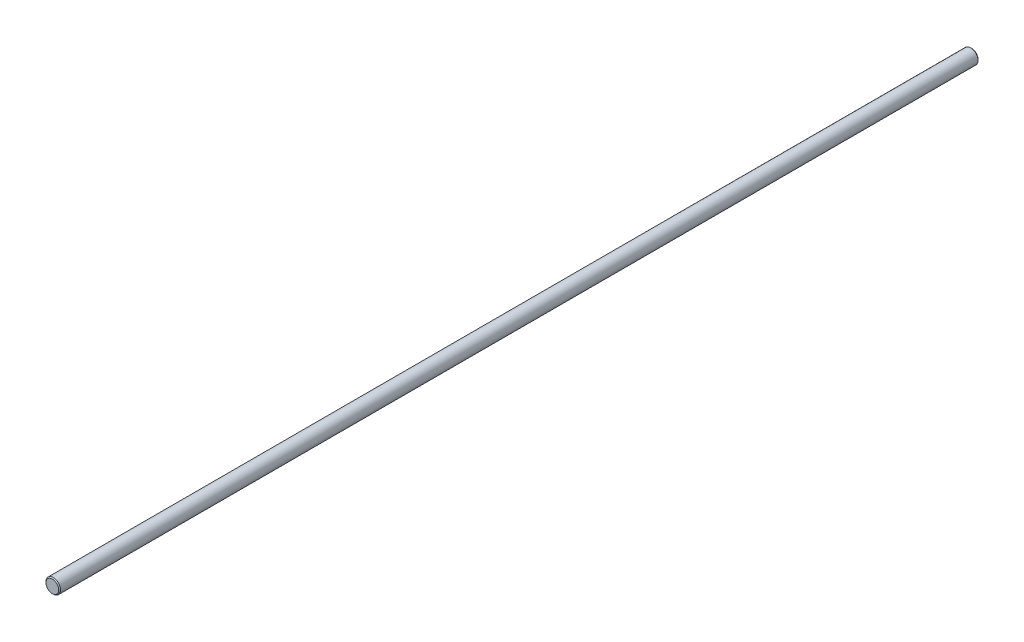
ISO-10303-21;
HEADER;
FILE_DESCRIPTION(('STEP AP214'),'2;1');
FILE_NAME('part.step','',(''),(''),'','','');
FILE_SCHEMA(('AUTOMOTIVE_DESIGN { 1 0 10303 214 1 1 1 1 }'));
ENDSEC;
DATA;
#1=APPLICATION_CONTEXT('core data for automotive mechanical design processes');
#2=APPLICATION_PROTOCOL_DEFINITION('international standard','automotive_design',2000,#1);
#3=PRODUCT_CONTEXT('',#1,'mechanical');
#4=PRODUCT('Part','Part','',(#3));
#5=PRODUCT_RELATED_PRODUCT_CATEGORY('part','',(#4));
#6=PRODUCT_DEFINITION_FORMATION('','',#4);
#7=PRODUCT_DEFINITION_CONTEXT('part definition',#1,'design');
#8=PRODUCT_DEFINITION('design','',#6,#7);
#9=PRODUCT_DEFINITION_SHAPE('','',#8);
#10=(LENGTH_UNIT() NAMED_UNIT(*) SI_UNIT(.MILLI.,.METRE.));
#11=(NAMED_UNIT(*) PLANE_ANGLE_UNIT() SI_UNIT($,.RADIAN.));
#12=(NAMED_UNIT(*) SI_UNIT($,.STERADIAN.) SOLID_ANGLE_UNIT());
#13=UNCERTAINTY_MEASURE_WITH_UNIT(LENGTH_MEASURE(1.E-05),#10,'distance_accuracy_value','');
#14=(GEOMETRIC_REPRESENTATION_CONTEXT(3) GLOBAL_UNCERTAINTY_ASSIGNED_CONTEXT((#13)) GLOBAL_UNIT_ASSIGNED_CONTEXT((#10,
#11,#12)) REPRESENTATION_CONTEXT('',''));
#15=CARTESIAN_POINT('',(0.,0.,0.));
#16=DIRECTION('',(0.,0.,1.));
#17=DIRECTION('',(1.,0.,0.));
#18=AXIS2_PLACEMENT_3D('',#15,#16,#17);
#19=CARTESIAN_POINT('',(0.,0.,500.));
#20=DIRECTION('',(0.,0.,-1.));
#21=DIRECTION('',(-1.,0.,0.));
#22=AXIS2_PLACEMENT_3D('',#19,#20,#21);
#23=CYLINDRICAL_SURFACE('',#22,3.95);
#24=CARTESIAN_POINT('',(0.,0.,499.5));
#25=DIRECTION('',(0.,0.,1.));
#26=DIRECTION('',(1.,0.,0.));
#27=AXIS2_PLACEMENT_3D('',#24,#25,#26);
#28=CIRCLE('',#27,3.95);
#29=CARTESIAN_POINT('',(3.95,0.,499.5));
#30=VERTEX_POINT('',#29);
#31=EDGE_CURVE('E38',#30,#30,#28,.F.);
#32=ORIENTED_EDGE('',*,*,#31,.T.);
#33=EDGE_LOOP('',(#32));
#34=FACE_BOUND('',#33,.T.);
#35=CARTESIAN_POINT('',(0.,0.,0.5));
#36=DIRECTION('',(0.,0.,1.));
#37=DIRECTION('',(1.,0.,0.));
#38=AXIS2_PLACEMENT_3D('',#35,#36,#37);
#39=CIRCLE('',#38,3.95);
#40=CARTESIAN_POINT('',(3.95,0.,0.5));
#41=VERTEX_POINT('',#40);
#42=EDGE_CURVE('E42',#41,#41,#39,.T.);
#43=ORIENTED_EDGE('',*,*,#42,.T.);
#44=EDGE_LOOP('',(#43));
#45=FACE_BOUND('',#44,.T.);
#46=ADVANCED_FACE('F31',(#34,#45),#23,.T.);
#47=CARTESIAN_POINT('',(0.,0.,500.));
#48=DIRECTION('',(0.,0.,1.));
#49=DIRECTION('',(1.,0.,0.));
#50=AXIS2_PLACEMENT_3D('',#47,#48,#49);
#51=PLANE('',#50);
#52=CARTESIAN_POINT('',(0.,0.,500.));
#53=DIRECTION('',(0.,0.,1.));
#54=DIRECTION('',(1.,0.,0.));
#55=AXIS2_PLACEMENT_3D('',#52,#53,#54);
#56=CIRCLE('',#55,3.4499999999999);
#57=CARTESIAN_POINT('',(3.4499999999999,0.,500.));
#58=VERTEX_POINT('',#57);
#59=EDGE_CURVE('E46',#58,#58,#56,.T.);
#60=ORIENTED_EDGE('',*,*,#59,.T.);
#61=EDGE_LOOP('',(#60));
#62=FACE_BOUND('',#61,.T.);
#63=ADVANCED_FACE('F52',(#62),#51,.T.);
#64=CARTESIAN_POINT('',(0.,0.,0.));
#65=DIRECTION('',(0.,0.,1.));
#66=DIRECTION('',(1.,0.,0.));
#67=AXIS2_PLACEMENT_3D('',#64,#65,#66);
#68=PLANE('',#67);
#69=CARTESIAN_POINT('',(0.,0.,0.));
#70=DIRECTION('',(0.,0.,1.));
#71=DIRECTION('',(1.,0.,0.));
#72=AXIS2_PLACEMENT_3D('',#69,#70,#71);
#73=CIRCLE('',#72,3.45000000000001);
#74=CARTESIAN_POINT('',(3.45000000000001,0.,0.));
#75=VERTEX_POINT('',#74);
#76=EDGE_CURVE('E10',#75,#75,#73,.F.);
#77=ORIENTED_EDGE('',*,*,#76,.T.);
#78=EDGE_LOOP('',(#77));
#79=FACE_BOUND('',#78,.T.);
#80=ADVANCED_FACE('F56',(#79),#68,.F.);
#81=CARTESIAN_POINT('',(0.,0.,500.));
#82=DIRECTION('',(0.,0.,-1.));
#83=DIRECTION('',(-1.,0.,0.));
#84=AXIS2_PLACEMENT_3D('',#81,#82,#83);
#85=CONICAL_SURFACE('',#84,3.4499999999999,0.785398163397495);
#86=ORIENTED_EDGE('',*,*,#31,.F.);
#87=EDGE_LOOP('',(#86));
#88=FACE_BOUND('',#87,.T.);
#89=ORIENTED_EDGE('',*,*,#59,.F.);
#90=EDGE_LOOP('',(#89));
#91=FACE_BOUND('',#90,.T.);
#92=ADVANCED_FACE('F54',(#88,#91),#85,.T.);
#93=CARTESIAN_POINT('',(0.,0.,0.5));
#94=DIRECTION('',(0.,0.,1.));
#95=DIRECTION('',(1.,0.,0.));
#96=AXIS2_PLACEMENT_3D('',#93,#94,#95);
#97=CONICAL_SURFACE('',#96,3.95,0.78539816339744);
#98=ORIENTED_EDGE('',*,*,#76,.F.);
#99=EDGE_LOOP('',(#98));
#100=FACE_BOUND('',#99,.T.);
#101=ORIENTED_EDGE('',*,*,#42,.F.);
#102=EDGE_LOOP('',(#101));
#103=FACE_BOUND('',#102,.T.);
#104=ADVANCED_FACE('F33',(#100,#103),#97,.T.);
#105=CLOSED_SHELL('',(#46,#63,#80,#92,#104));
#106=MANIFOLD_SOLID_BREP('B2',#105);
#107=ADVANCED_BREP_SHAPE_REPRESENTATION('',(#18,#106),#14);
#108=SHAPE_DEFINITION_REPRESENTATION(#9,#107);
ENDSEC;
END-ISO-10303-21;
